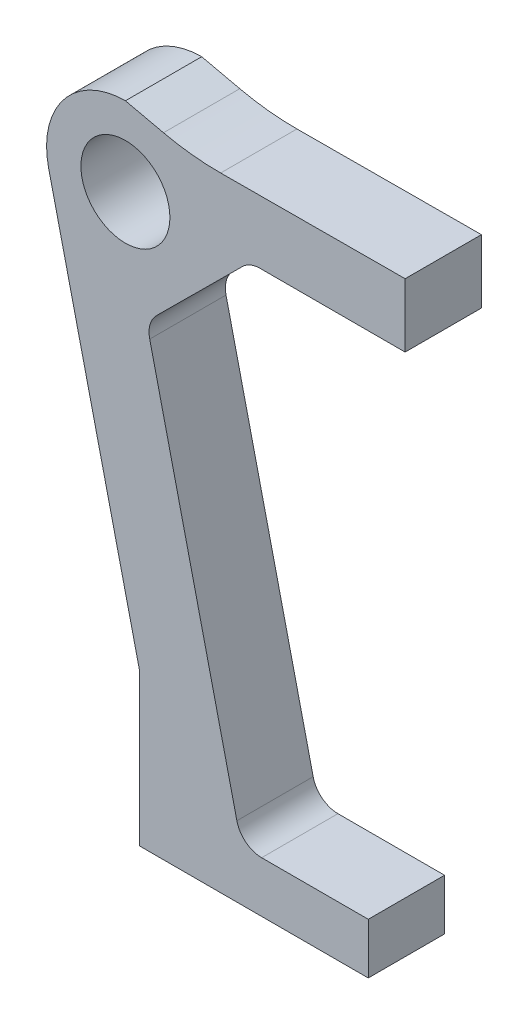
ISO-10303-21;
HEADER;
FILE_DESCRIPTION(('STEP AP214'),'2;1');
FILE_NAME('part.step','',(''),(''),'','','');
FILE_SCHEMA(('AUTOMOTIVE_DESIGN { 1 0 10303 214 1 1 1 1 }'));
ENDSEC;
DATA;
#1=APPLICATION_CONTEXT('core data for automotive mechanical design processes');
#2=APPLICATION_PROTOCOL_DEFINITION('international standard','automotive_design',2000,#1);
#3=PRODUCT_CONTEXT('',#1,'mechanical');
#4=PRODUCT('Part','Part','',(#3));
#5=PRODUCT_RELATED_PRODUCT_CATEGORY('part','',(#4));
#6=PRODUCT_DEFINITION_FORMATION('','',#4);
#7=PRODUCT_DEFINITION_CONTEXT('part definition',#1,'design');
#8=PRODUCT_DEFINITION('design','',#6,#7);
#9=PRODUCT_DEFINITION_SHAPE('','',#8);
#10=(LENGTH_UNIT() NAMED_UNIT(*) SI_UNIT(.MILLI.,.METRE.));
#11=(NAMED_UNIT(*) PLANE_ANGLE_UNIT() SI_UNIT($,.RADIAN.));
#12=(NAMED_UNIT(*) SI_UNIT($,.STERADIAN.) SOLID_ANGLE_UNIT());
#13=UNCERTAINTY_MEASURE_WITH_UNIT(LENGTH_MEASURE(1.E-05),#10,'distance_accuracy_value','');
#14=(GEOMETRIC_REPRESENTATION_CONTEXT(3) GLOBAL_UNCERTAINTY_ASSIGNED_CONTEXT((#13)) GLOBAL_UNIT_ASSIGNED_CONTEXT((#10,
#11,#12)) REPRESENTATION_CONTEXT('',''));
#15=CARTESIAN_POINT('',(0.,0.,0.));
#16=DIRECTION('',(0.,0.,1.));
#17=DIRECTION('',(1.,0.,0.));
#18=AXIS2_PLACEMENT_3D('',#15,#16,#17);
#19=CARTESIAN_POINT('',(9.357429757377,-4.925,3.2));
#20=DIRECTION('',(0.,0.,-1.));
#21=DIRECTION('',(-1.,0.,0.));
#22=AXIS2_PLACEMENT_3D('',#19,#20,#21);
#23=PLANE('',#22);
#24=DIRECTION('',(0.,-1.,0.));
#25=VECTOR('',#24,1.);
#26=CARTESIAN_POINT('',(4.55,-1.925,3.2));
#27=LINE('',#26,#25);
#28=CARTESIAN_POINT('',(4.55,-1.925,3.2));
#29=VERTEX_POINT('',#28);
#30=CARTESIAN_POINT('',(4.55000000000001,-7.925,3.2));
#31=VERTEX_POINT('',#30);
#32=EDGE_CURVE('E215',#29,#31,#27,.T.);
#33=ORIENTED_EDGE('',*,*,#32,.T.);
#34=DIRECTION('',(1.,0.,0.));
#35=VECTOR('',#34,1.);
#36=CARTESIAN_POINT('',(4.55000000000001,-7.925,3.2));
#37=LINE('',#36,#35);
#38=CARTESIAN_POINT('',(13.55,-7.925,3.2));
#39=VERTEX_POINT('',#38);
#40=EDGE_CURVE('E123',#31,#39,#37,.T.);
#41=ORIENTED_EDGE('',*,*,#40,.T.);
#42=DIRECTION('',(0.,1.,0.));
#43=VECTOR('',#42,1.);
#44=CARTESIAN_POINT('',(13.55,-7.925,3.2));
#45=LINE('',#44,#43);
#46=CARTESIAN_POINT('',(13.55,-5.925,3.2));
#47=VERTEX_POINT('',#46);
#48=EDGE_CURVE('E254',#39,#47,#45,.T.);
#49=ORIENTED_EDGE('',*,*,#48,.T.);
#50=DIRECTION('',(-1.,0.,0.));
#51=VECTOR('',#50,1.);
#52=CARTESIAN_POINT('',(13.55,-5.925,3.2));
#53=LINE('',#52,#51);
#54=CARTESIAN_POINT('',(9.357429757377,-5.925,3.2));
#55=VERTEX_POINT('',#54);
#56=EDGE_CURVE('E273',#47,#55,#53,.T.);
#57=ORIENTED_EDGE('',*,*,#56,.T.);
#58=CARTESIAN_POINT('',(9.357429757377,-4.925,3.2));
#59=DIRECTION('',(0.,0.,-1.));
#60=DIRECTION('',(-1.,0.,0.));
#61=AXIS2_PLACEMENT_3D('',#58,#59,#60);
#62=CIRCLE('',#61,1.);
#63=CARTESIAN_POINT('',(8.38358766247106,-5.15222582201239,3.2));
#64=VERTEX_POINT('',#63);
#65=EDGE_CURVE('E270',#55,#64,#62,.T.);
#66=ORIENTED_EDGE('',*,*,#65,.T.);
#67=DIRECTION('',(-0.227225822012392,0.973842094905941,0.));
#68=VECTOR('',#67,1.);
#69=CARTESIAN_POINT('',(8.38358766247106,-5.15222582201239,3.2));
#70=LINE('',#69,#68);
#71=CARTESIAN_POINT('',(4.95620251262334,9.5368262620205,3.2));
#72=VERTEX_POINT('',#71);
#73=EDGE_CURVE('E272',#64,#72,#70,.T.);
#74=ORIENTED_EDGE('',*,*,#73,.T.);
#75=CARTESIAN_POINT('',(5.93004460752928,9.76405208403289,3.2));
#76=DIRECTION('',(0.,0.,-1.));
#77=DIRECTION('',(-1.,0.,0.));
#78=AXIS2_PLACEMENT_3D('',#75,#76,#77);
#79=CIRCLE('',#78,1.);
#80=CARTESIAN_POINT('',(5.22498709725014,10.4732022142585,3.2));
#81=VERTEX_POINT('',#80);
#82=EDGE_CURVE('E275',#72,#81,#79,.T.);
#83=ORIENTED_EDGE('',*,*,#82,.T.);
#84=DIRECTION('',(0.709150130225592,0.705057510279145,0.));
#85=VECTOR('',#84,1.);
#86=CARTESIAN_POINT('',(5.22498709725014,10.4732022142585,3.2));
#87=LINE('',#86,#85);
#88=CARTESIAN_POINT('',(8.59600284324305,13.8247632838806,3.2));
#89=VERTEX_POINT('',#88);
#90=EDGE_CURVE('E281',#81,#89,#87,.T.);
#91=ORIENTED_EDGE('',*,*,#90,.T.);
#92=CARTESIAN_POINT('',(9.3010603535222,13.115613153655,3.2));
#93=DIRECTION('',(0.,0.,-1.));
#94=DIRECTION('',(1.,0.,0.));
#95=AXIS2_PLACEMENT_3D('',#92,#93,#94);
#96=CIRCLE('',#95,1.);
#97=CARTESIAN_POINT('',(9.3010603535222,14.115613153655,3.2));
#98=VERTEX_POINT('',#97);
#99=EDGE_CURVE('E283',#89,#98,#96,.T.);
#100=ORIENTED_EDGE('',*,*,#99,.T.);
#101=DIRECTION('',(1.,0.,0.));
#102=VECTOR('',#101,1.);
#103=CARTESIAN_POINT('',(15.,14.115613153655,3.2));
#104=LINE('',#103,#102);
#105=CARTESIAN_POINT('',(15.,14.115613153655,3.2));
#106=VERTEX_POINT('',#105);
#107=EDGE_CURVE('E285',#98,#106,#104,.T.);
#108=ORIENTED_EDGE('',*,*,#107,.T.);
#109=DIRECTION('',(0.,1.,0.));
#110=VECTOR('',#109,1.);
#111=CARTESIAN_POINT('',(15.,16.615613153655,3.2));
#112=LINE('',#111,#110);
#113=CARTESIAN_POINT('',(15.,16.615613153655,3.2));
#114=VERTEX_POINT('',#113);
#115=EDGE_CURVE('E287',#106,#114,#112,.T.);
#116=ORIENTED_EDGE('',*,*,#115,.T.);
#117=DIRECTION('',(-0.999992939798006,-0.00375770596806723,0.));
#118=VECTOR('',#117,1.);
#119=CARTESIAN_POINT('',(15.,16.615613153655,3.2));
#120=LINE('',#119,#118);
#121=CARTESIAN_POINT('',(7.74553051136755,16.5883527978988,3.2));
#122=VERTEX_POINT('',#121);
#123=EDGE_CURVE('E289',#114,#122,#120,.T.);
#124=ORIENTED_EDGE('',*,*,#123,.T.);
#125=CARTESIAN_POINT('',(7.70795345168687,26.5882821958789,3.2));
#126=DIRECTION('',(0.,0.,-1.));
#127=DIRECTION('',(-1.,0.,0.));
#128=AXIS2_PLACEMENT_3D('',#125,#126,#127);
#129=CIRCLE('',#128,10.);
#130=CARTESIAN_POINT('',(5.49786000033379,16.8355652956358,3.2));
#131=VERTEX_POINT('',#130);
#132=EDGE_CURVE('E166',#122,#131,#129,.T.);
#133=ORIENTED_EDGE('',*,*,#132,.T.);
#134=DIRECTION('',(-0.975271690024303,0.221009345135311,0.));
#135=VECTOR('',#134,1.);
#136=CARTESIAN_POINT('',(4.,17.175,3.2));
#137=LINE('',#136,#135);
#138=CARTESIAN_POINT('',(4.,17.175,3.2));
#139=VERTEX_POINT('',#138);
#140=EDGE_CURVE('E160',#131,#139,#137,.T.);
#141=ORIENTED_EDGE('',*,*,#140,.T.);
#142=CARTESIAN_POINT('',(4.,14.075,3.2));
#143=DIRECTION('',(0.,0.,1.));
#144=DIRECTION('',(1.,0.,0.));
#145=AXIS2_PLACEMENT_3D('',#142,#143,#144);
#146=CIRCLE('',#145,3.1);
#147=CARTESIAN_POINT('',(0.981089505791579,13.3705999517616,3.2));
#148=VERTEX_POINT('',#147);
#149=EDGE_CURVE('E164',#139,#148,#146,.T.);
#150=ORIENTED_EDGE('',*,*,#149,.T.);
#151=DIRECTION('',(0.227225822012392,-0.973842094905941,0.));
#152=VECTOR('',#151,1.);
#153=CARTESIAN_POINT('',(0.981089505791579,13.3705999517616,3.2));
#154=LINE('',#153,#152);
#155=EDGE_CURVE('E56',#148,#29,#154,.T.);
#156=ORIENTED_EDGE('',*,*,#155,.T.);
#157=EDGE_LOOP('',(#33,#41,#49,#57,#66,#74,#83,#91,#100,#108,#116,#124,#133,#141,#150,#156));
#158=FACE_BOUND('',#157,.T.);
#159=CARTESIAN_POINT('',(4.,14.075,3.2));
#160=DIRECTION('',(0.,0.,1.));
#161=DIRECTION('',(1.,0.,0.));
#162=AXIS2_PLACEMENT_3D('',#159,#160,#161);
#163=CIRCLE('',#162,1.75);
#164=CARTESIAN_POINT('',(5.75,14.075,3.2));
#165=VERTEX_POINT('',#164);
#166=EDGE_CURVE('E188',#165,#165,#163,.T.);
#167=ORIENTED_EDGE('',*,*,#166,.F.);
#168=EDGE_LOOP('',(#167));
#169=FACE_BOUND('',#168,.T.);
#170=ADVANCED_FACE('F39',(#158,#169),#23,.F.);
#171=CARTESIAN_POINT('',(9.357429757377,-4.925,0.2));
#172=DIRECTION('',(0.,0.,-1.));
#173=DIRECTION('',(-1.,0.,0.));
#174=AXIS2_PLACEMENT_3D('',#171,#172,#173);
#175=PLANE('',#174);
#176=DIRECTION('',(0.,-1.,0.));
#177=VECTOR('',#176,1.);
#178=CARTESIAN_POINT('',(4.55,-1.925,0.2));
#179=LINE('',#178,#177);
#180=CARTESIAN_POINT('',(4.55,-1.925,0.2));
#181=VERTEX_POINT('',#180);
#182=CARTESIAN_POINT('',(4.55000000000001,-7.925,0.2));
#183=VERTEX_POINT('',#182);
#184=EDGE_CURVE('E184',#181,#183,#179,.T.);
#185=ORIENTED_EDGE('',*,*,#184,.F.);
#186=DIRECTION('',(0.227225822012392,-0.973842094905941,0.));
#187=VECTOR('',#186,1.);
#188=CARTESIAN_POINT('',(0.981089505791579,13.3705999517616,0.2));
#189=LINE('',#188,#187);
#190=CARTESIAN_POINT('',(0.981089505791579,13.3705999517616,0.2));
#191=VERTEX_POINT('',#190);
#192=EDGE_CURVE('E115',#191,#181,#189,.T.);
#193=ORIENTED_EDGE('',*,*,#192,.F.);
#194=CARTESIAN_POINT('',(4.,14.075,0.2));
#195=DIRECTION('',(0.,0.,1.));
#196=DIRECTION('',(1.,0.,0.));
#197=AXIS2_PLACEMENT_3D('',#194,#195,#196);
#198=CIRCLE('',#197,3.1);
#199=CARTESIAN_POINT('',(4.,17.175,0.2));
#200=VERTEX_POINT('',#199);
#201=EDGE_CURVE('E109',#200,#191,#198,.T.);
#202=ORIENTED_EDGE('',*,*,#201,.F.);
#203=DIRECTION('',(-0.975271690024303,0.221009345135311,0.));
#204=VECTOR('',#203,1.);
#205=CARTESIAN_POINT('',(4.,17.175,0.2));
#206=LINE('',#205,#204);
#207=CARTESIAN_POINT('',(5.49786000033379,16.8355652956358,0.2));
#208=VERTEX_POINT('',#207);
#209=EDGE_CURVE('E174',#208,#200,#206,.T.);
#210=ORIENTED_EDGE('',*,*,#209,.F.);
#211=CARTESIAN_POINT('',(7.70795345168687,26.5882821958789,0.2));
#212=DIRECTION('',(0.,0.,-1.));
#213=DIRECTION('',(-1.,0.,0.));
#214=AXIS2_PLACEMENT_3D('',#211,#212,#213);
#215=CIRCLE('',#214,10.);
#216=CARTESIAN_POINT('',(7.74553051136755,16.5883527978988,0.2));
#217=VERTEX_POINT('',#216);
#218=EDGE_CURVE('E210',#217,#208,#215,.T.);
#219=ORIENTED_EDGE('',*,*,#218,.F.);
#220=DIRECTION('',(-0.999992939798006,-0.00375770596806723,0.));
#221=VECTOR('',#220,1.);
#222=CARTESIAN_POINT('',(15.,16.615613153655,0.2));
#223=LINE('',#222,#221);
#224=CARTESIAN_POINT('',(15.,16.615613153655,0.2));
#225=VERTEX_POINT('',#224);
#226=EDGE_CURVE('E208',#225,#217,#223,.T.);
#227=ORIENTED_EDGE('',*,*,#226,.F.);
#228=DIRECTION('',(0.,1.,0.));
#229=VECTOR('',#228,1.);
#230=CARTESIAN_POINT('',(15.,16.615613153655,0.2));
#231=LINE('',#230,#229);
#232=CARTESIAN_POINT('',(15.,14.115613153655,0.2));
#233=VERTEX_POINT('',#232);
#234=EDGE_CURVE('E206',#233,#225,#231,.T.);
#235=ORIENTED_EDGE('',*,*,#234,.F.);
#236=DIRECTION('',(1.,0.,0.));
#237=VECTOR('',#236,1.);
#238=CARTESIAN_POINT('',(15.,14.115613153655,0.2));
#239=LINE('',#238,#237);
#240=CARTESIAN_POINT('',(9.3010603535222,14.115613153655,0.2));
#241=VERTEX_POINT('',#240);
#242=EDGE_CURVE('E204',#241,#233,#239,.T.);
#243=ORIENTED_EDGE('',*,*,#242,.F.);
#244=CARTESIAN_POINT('',(9.3010603535222,13.115613153655,0.2));
#245=DIRECTION('',(0.,0.,-1.));
#246=DIRECTION('',(1.,0.,0.));
#247=AXIS2_PLACEMENT_3D('',#244,#245,#246);
#248=CIRCLE('',#247,1.);
#249=CARTESIAN_POINT('',(8.59600284324305,13.8247632838806,0.2));
#250=VERTEX_POINT('',#249);
#251=EDGE_CURVE('E202',#250,#241,#248,.T.);
#252=ORIENTED_EDGE('',*,*,#251,.F.);
#253=DIRECTION('',(0.709150130225592,0.705057510279145,0.));
#254=VECTOR('',#253,1.);
#255=CARTESIAN_POINT('',(5.22498709725014,10.4732022142585,0.2));
#256=LINE('',#255,#254);
#257=CARTESIAN_POINT('',(5.22498709725014,10.4732022142585,0.2));
#258=VERTEX_POINT('',#257);
#259=EDGE_CURVE('E200',#258,#250,#256,.T.);
#260=ORIENTED_EDGE('',*,*,#259,.F.);
#261=CARTESIAN_POINT('',(5.93004460752928,9.76405208403289,0.2));
#262=DIRECTION('',(0.,0.,-1.));
#263=DIRECTION('',(-1.,0.,0.));
#264=AXIS2_PLACEMENT_3D('',#261,#262,#263);
#265=CIRCLE('',#264,1.);
#266=CARTESIAN_POINT('',(4.95620251262334,9.5368262620205,0.2));
#267=VERTEX_POINT('',#266);
#268=EDGE_CURVE('E198',#267,#258,#265,.T.);
#269=ORIENTED_EDGE('',*,*,#268,.F.);
#270=DIRECTION('',(-0.227225822012392,0.973842094905941,0.));
#271=VECTOR('',#270,1.);
#272=CARTESIAN_POINT('',(8.38358766247106,-5.15222582201239,0.2));
#273=LINE('',#272,#271);
#274=CARTESIAN_POINT('',(8.38358766247106,-5.15222582201239,0.2));
#275=VERTEX_POINT('',#274);
#276=EDGE_CURVE('E196',#275,#267,#273,.T.);
#277=ORIENTED_EDGE('',*,*,#276,.F.);
#278=CARTESIAN_POINT('',(9.357429757377,-4.925,0.2));
#279=DIRECTION('',(0.,0.,-1.));
#280=DIRECTION('',(-1.,0.,0.));
#281=AXIS2_PLACEMENT_3D('',#278,#279,#280);
#282=CIRCLE('',#281,1.);
#283=CARTESIAN_POINT('',(9.357429757377,-5.925,0.2));
#284=VERTEX_POINT('',#283);
#285=EDGE_CURVE('E194',#284,#275,#282,.T.);
#286=ORIENTED_EDGE('',*,*,#285,.F.);
#287=DIRECTION('',(-1.,0.,0.));
#288=VECTOR('',#287,1.);
#289=CARTESIAN_POINT('',(13.55,-5.925,0.2));
#290=LINE('',#289,#288);
#291=CARTESIAN_POINT('',(13.55,-5.925,0.2));
#292=VERTEX_POINT('',#291);
#293=EDGE_CURVE('E192',#292,#284,#290,.T.);
#294=ORIENTED_EDGE('',*,*,#293,.F.);
#295=DIRECTION('',(0.,1.,0.));
#296=VECTOR('',#295,1.);
#297=CARTESIAN_POINT('',(13.55,-7.925,0.2));
#298=LINE('',#297,#296);
#299=CARTESIAN_POINT('',(13.55,-7.925,0.2));
#300=VERTEX_POINT('',#299);
#301=EDGE_CURVE('E190',#300,#292,#298,.T.);
#302=ORIENTED_EDGE('',*,*,#301,.F.);
#303=DIRECTION('',(1.,0.,0.));
#304=VECTOR('',#303,1.);
#305=CARTESIAN_POINT('',(4.55000000000001,-7.925,0.2));
#306=LINE('',#305,#304);
#307=EDGE_CURVE('E187',#183,#300,#306,.T.);
#308=ORIENTED_EDGE('',*,*,#307,.F.);
#309=EDGE_LOOP('',(#185,#193,#202,#210,#219,#227,#235,#243,#252,#260,#269,#277,#286,#294,#302,#308));
#310=FACE_BOUND('',#309,.T.);
#311=CARTESIAN_POINT('',(4.,14.075,0.2));
#312=DIRECTION('',(0.,0.,1.));
#313=DIRECTION('',(1.,0.,0.));
#314=AXIS2_PLACEMENT_3D('',#311,#312,#313);
#315=CIRCLE('',#314,1.75);
#316=CARTESIAN_POINT('',(5.75,14.075,0.2));
#317=VERTEX_POINT('',#316);
#318=EDGE_CURVE('E488',#317,#317,#315,.T.);
#319=ORIENTED_EDGE('',*,*,#318,.T.);
#320=EDGE_LOOP('',(#319));
#321=FACE_BOUND('',#320,.T.);
#322=ADVANCED_FACE('F258',(#310,#321),#175,.T.);
#323=CARTESIAN_POINT('',(4.55,-1.925,3.2));
#324=DIRECTION('',(1.,0.,0.));
#325=DIRECTION('',(0.,1.,0.));
#326=AXIS2_PLACEMENT_3D('',#323,#324,#325);
#327=PLANE('',#326);
#328=ORIENTED_EDGE('',*,*,#184,.T.);
#329=DIRECTION('',(0.,0.,-1.));
#330=VECTOR('',#329,1.);
#331=CARTESIAN_POINT('',(4.55000000000001,-7.925,3.2));
#332=LINE('',#331,#330);
#333=EDGE_CURVE('E11',#31,#183,#332,.T.);
#334=ORIENTED_EDGE('',*,*,#333,.F.);
#335=ORIENTED_EDGE('',*,*,#32,.F.);
#336=DIRECTION('',(0.,0.,-1.));
#337=VECTOR('',#336,1.);
#338=CARTESIAN_POINT('',(4.55,-1.925,3.2));
#339=LINE('',#338,#337);
#340=EDGE_CURVE('E180',#29,#181,#339,.T.);
#341=ORIENTED_EDGE('',*,*,#340,.T.);
#342=EDGE_LOOP('',(#328,#334,#335,#341));
#343=FACE_BOUND('',#342,.T.);
#344=ADVANCED_FACE('F41',(#343),#327,.F.);
#345=CARTESIAN_POINT('',(4.55000000000001,-7.925,3.2));
#346=DIRECTION('',(0.,1.,0.));
#347=DIRECTION('',(0.,0.,1.));
#348=AXIS2_PLACEMENT_3D('',#345,#346,#347);
#349=PLANE('',#348);
#350=ORIENTED_EDGE('',*,*,#307,.T.);
#351=DIRECTION('',(0.,0.,-1.));
#352=VECTOR('',#351,1.);
#353=CARTESIAN_POINT('',(13.55,-7.925,3.2));
#354=LINE('',#353,#352);
#355=EDGE_CURVE('E48',#39,#300,#354,.T.);
#356=ORIENTED_EDGE('',*,*,#355,.F.);
#357=ORIENTED_EDGE('',*,*,#40,.F.);
#358=ORIENTED_EDGE('',*,*,#333,.T.);
#359=EDGE_LOOP('',(#350,#356,#357,#358));
#360=FACE_BOUND('',#359,.T.);
#361=ADVANCED_FACE('F323',(#360),#349,.F.);
#362=CARTESIAN_POINT('',(13.55,-7.925,3.2));
#363=DIRECTION('',(-1.,0.,0.));
#364=DIRECTION('',(0.,0.,1.));
#365=AXIS2_PLACEMENT_3D('',#362,#363,#364);
#366=PLANE('',#365);
#367=ORIENTED_EDGE('',*,*,#301,.T.);
#368=DIRECTION('',(0.,0.,-1.));
#369=VECTOR('',#368,1.);
#370=CARTESIAN_POINT('',(13.55,-5.925,3.2));
#371=LINE('',#370,#369);
#372=EDGE_CURVE('E246',#47,#292,#371,.T.);
#373=ORIENTED_EDGE('',*,*,#372,.F.);
#374=ORIENTED_EDGE('',*,*,#48,.F.);
#375=ORIENTED_EDGE('',*,*,#355,.T.);
#376=EDGE_LOOP('',(#367,#373,#374,#375));
#377=FACE_BOUND('',#376,.T.);
#378=ADVANCED_FACE('F252',(#377),#366,.F.);
#379=CARTESIAN_POINT('',(13.55,-5.925,3.2));
#380=DIRECTION('',(0.,-1.,0.));
#381=DIRECTION('',(0.,0.,-1.));
#382=AXIS2_PLACEMENT_3D('',#379,#380,#381);
#383=PLANE('',#382);
#384=ORIENTED_EDGE('',*,*,#293,.T.);
#385=DIRECTION('',(0.,0.,-1.));
#386=VECTOR('',#385,1.);
#387=CARTESIAN_POINT('',(9.357429757377,-5.925,3.2));
#388=LINE('',#387,#386);
#389=EDGE_CURVE('E243',#55,#284,#388,.T.);
#390=ORIENTED_EDGE('',*,*,#389,.F.);
#391=ORIENTED_EDGE('',*,*,#56,.F.);
#392=ORIENTED_EDGE('',*,*,#372,.T.);
#393=EDGE_LOOP('',(#384,#390,#391,#392));
#394=FACE_BOUND('',#393,.T.);
#395=ADVANCED_FACE('F264',(#394),#383,.F.);
#396=CARTESIAN_POINT('',(9.357429757377,-4.925,3.2));
#397=DIRECTION('',(0.,0.,-1.));
#398=DIRECTION('',(-1.,0.,0.));
#399=AXIS2_PLACEMENT_3D('',#396,#397,#398);
#400=CYLINDRICAL_SURFACE('',#399,1.);
#401=ORIENTED_EDGE('',*,*,#285,.T.);
#402=DIRECTION('',(0.,0.,-1.));
#403=VECTOR('',#402,1.);
#404=CARTESIAN_POINT('',(8.38358766247106,-5.15222582201239,3.2));
#405=LINE('',#404,#403);
#406=EDGE_CURVE('E240',#64,#275,#405,.T.);
#407=ORIENTED_EDGE('',*,*,#406,.F.);
#408=ORIENTED_EDGE('',*,*,#65,.F.);
#409=ORIENTED_EDGE('',*,*,#389,.T.);
#410=EDGE_LOOP('',(#401,#407,#408,#409));
#411=FACE_BOUND('',#410,.T.);
#412=ADVANCED_FACE('F268',(#411),#400,.F.);
#413=CARTESIAN_POINT('',(8.38358766247106,-5.15222582201239,3.2));
#414=DIRECTION('',(-0.973842094905942,-0.227225822012392,0.));
#415=DIRECTION('',(0.227225822012392,-0.973842094905942,0.));
#416=AXIS2_PLACEMENT_3D('',#413,#414,#415);
#417=PLANE('',#416);
#418=ORIENTED_EDGE('',*,*,#276,.T.);
#419=DIRECTION('',(0.,0.,-1.));
#420=VECTOR('',#419,1.);
#421=CARTESIAN_POINT('',(4.95620251262334,9.5368262620205,3.2));
#422=LINE('',#421,#420);
#423=EDGE_CURVE('E237',#72,#267,#422,.T.);
#424=ORIENTED_EDGE('',*,*,#423,.F.);
#425=ORIENTED_EDGE('',*,*,#73,.F.);
#426=ORIENTED_EDGE('',*,*,#406,.T.);
#427=EDGE_LOOP('',(#418,#424,#425,#426));
#428=FACE_BOUND('',#427,.T.);
#429=ADVANCED_FACE('F336',(#428),#417,.F.);
#430=CARTESIAN_POINT('',(5.93004460752928,9.76405208403289,3.2));
#431=DIRECTION('',(0.,0.,-1.));
#432=DIRECTION('',(-1.,0.,0.));
#433=AXIS2_PLACEMENT_3D('',#430,#431,#432);
#434=CYLINDRICAL_SURFACE('',#433,1.);
#435=ORIENTED_EDGE('',*,*,#268,.T.);
#436=DIRECTION('',(0.,0.,-1.));
#437=VECTOR('',#436,1.);
#438=CARTESIAN_POINT('',(5.22498709725014,10.4732022142585,3.2));
#439=LINE('',#438,#437);
#440=EDGE_CURVE('E234',#81,#258,#439,.T.);
#441=ORIENTED_EDGE('',*,*,#440,.F.);
#442=ORIENTED_EDGE('',*,*,#82,.F.);
#443=ORIENTED_EDGE('',*,*,#423,.T.);
#444=EDGE_LOOP('',(#435,#441,#442,#443));
#445=FACE_BOUND('',#444,.T.);
#446=ADVANCED_FACE('F339',(#445),#434,.F.);
#447=CARTESIAN_POINT('',(5.22498709725014,10.4732022142585,3.2));
#448=DIRECTION('',(-0.705057510279145,0.709150130225592,0.));
#449=DIRECTION('',(-0.709150130225592,-0.705057510279145,0.));
#450=AXIS2_PLACEMENT_3D('',#447,#448,#449);
#451=PLANE('',#450);
#452=ORIENTED_EDGE('',*,*,#259,.T.);
#453=DIRECTION('',(0.,0.,-1.));
#454=VECTOR('',#453,1.);
#455=CARTESIAN_POINT('',(8.59600284324305,13.8247632838806,3.2));
#456=LINE('',#455,#454);
#457=EDGE_CURVE('E231',#89,#250,#456,.T.);
#458=ORIENTED_EDGE('',*,*,#457,.F.);
#459=ORIENTED_EDGE('',*,*,#90,.F.);
#460=ORIENTED_EDGE('',*,*,#440,.T.);
#461=EDGE_LOOP('',(#452,#458,#459,#460));
#462=FACE_BOUND('',#461,.T.);
#463=ADVANCED_FACE('F343',(#462),#451,.F.);
#464=CARTESIAN_POINT('',(9.3010603535222,13.115613153655,3.2));
#465=DIRECTION('',(0.,0.,-1.));
#466=DIRECTION('',(-1.,0.,0.));
#467=AXIS2_PLACEMENT_3D('',#464,#465,#466);
#468=CYLINDRICAL_SURFACE('',#467,1.);
#469=ORIENTED_EDGE('',*,*,#251,.T.);
#470=DIRECTION('',(0.,0.,-1.));
#471=VECTOR('',#470,1.);
#472=CARTESIAN_POINT('',(9.3010603535222,14.115613153655,3.2));
#473=LINE('',#472,#471);
#474=EDGE_CURVE('E228',#98,#241,#473,.T.);
#475=ORIENTED_EDGE('',*,*,#474,.F.);
#476=ORIENTED_EDGE('',*,*,#99,.F.);
#477=ORIENTED_EDGE('',*,*,#457,.T.);
#478=EDGE_LOOP('',(#469,#475,#476,#477));
#479=FACE_BOUND('',#478,.T.);
#480=ADVANCED_FACE('F347',(#479),#468,.F.);
#481=CARTESIAN_POINT('',(15.,14.115613153655,3.2));
#482=DIRECTION('',(0.,1.,0.));
#483=DIRECTION('',(-1.,0.,0.));
#484=AXIS2_PLACEMENT_3D('',#481,#482,#483);
#485=PLANE('',#484);
#486=ORIENTED_EDGE('',*,*,#242,.T.);
#487=DIRECTION('',(0.,0.,-1.));
#488=VECTOR('',#487,1.);
#489=CARTESIAN_POINT('',(15.,14.115613153655,3.2));
#490=LINE('',#489,#488);
#491=EDGE_CURVE('E225',#106,#233,#490,.T.);
#492=ORIENTED_EDGE('',*,*,#491,.F.);
#493=ORIENTED_EDGE('',*,*,#107,.F.);
#494=ORIENTED_EDGE('',*,*,#474,.T.);
#495=EDGE_LOOP('',(#486,#492,#493,#494));
#496=FACE_BOUND('',#495,.T.);
#497=ADVANCED_FACE('F351',(#496),#485,.F.);
#498=CARTESIAN_POINT('',(15.,16.615613153655,3.2));
#499=DIRECTION('',(-1.,0.,0.));
#500=DIRECTION('',(0.,0.,1.));
#501=AXIS2_PLACEMENT_3D('',#498,#499,#500);
#502=PLANE('',#501);
#503=ORIENTED_EDGE('',*,*,#234,.T.);
#504=DIRECTION('',(0.,0.,-1.));
#505=VECTOR('',#504,1.);
#506=CARTESIAN_POINT('',(15.,16.615613153655,3.2));
#507=LINE('',#506,#505);
#508=EDGE_CURVE('E222',#114,#225,#507,.T.);
#509=ORIENTED_EDGE('',*,*,#508,.F.);
#510=ORIENTED_EDGE('',*,*,#115,.F.);
#511=ORIENTED_EDGE('',*,*,#491,.T.);
#512=EDGE_LOOP('',(#503,#509,#510,#511));
#513=FACE_BOUND('',#512,.T.);
#514=ADVANCED_FACE('F355',(#513),#502,.F.);
#515=CARTESIAN_POINT('',(15.,16.615613153655,3.2));
#516=DIRECTION('',(0.00375770596806723,-0.999992939798006,0.));
#517=DIRECTION('',(0.999992939798006,0.00375770596806723,0.));
#518=AXIS2_PLACEMENT_3D('',#515,#516,#517);
#519=PLANE('',#518);
#520=ORIENTED_EDGE('',*,*,#226,.T.);
#521=DIRECTION('',(0.,0.,-1.));
#522=VECTOR('',#521,1.);
#523=CARTESIAN_POINT('',(7.74553051136755,16.5883527978988,3.2));
#524=LINE('',#523,#522);
#525=EDGE_CURVE('E219',#122,#217,#524,.T.);
#526=ORIENTED_EDGE('',*,*,#525,.F.);
#527=ORIENTED_EDGE('',*,*,#123,.F.);
#528=ORIENTED_EDGE('',*,*,#508,.T.);
#529=EDGE_LOOP('',(#520,#526,#527,#528));
#530=FACE_BOUND('',#529,.T.);
#531=ADVANCED_FACE('F295',(#530),#519,.F.);
#532=CARTESIAN_POINT('',(7.70795345168687,26.5882821958789,3.2));
#533=DIRECTION('',(0.,0.,-1.));
#534=DIRECTION('',(-1.,0.,0.));
#535=AXIS2_PLACEMENT_3D('',#532,#533,#534);
#536=CYLINDRICAL_SURFACE('',#535,10.);
#537=ORIENTED_EDGE('',*,*,#218,.T.);
#538=DIRECTION('',(0.,0.,-1.));
#539=VECTOR('',#538,1.);
#540=CARTESIAN_POINT('',(5.49786000033379,16.8355652956358,3.2));
#541=LINE('',#540,#539);
#542=EDGE_CURVE('E175',#131,#208,#541,.T.);
#543=ORIENTED_EDGE('',*,*,#542,.F.);
#544=ORIENTED_EDGE('',*,*,#132,.F.);
#545=ORIENTED_EDGE('',*,*,#525,.T.);
#546=EDGE_LOOP('',(#537,#543,#544,#545));
#547=FACE_BOUND('',#546,.T.);
#548=ADVANCED_FACE('F299',(#547),#536,.F.);
#549=CARTESIAN_POINT('',(4.,17.175,3.2));
#550=DIRECTION('',(-0.221009345135311,-0.975271690024303,0.));
#551=DIRECTION('',(0.975271690024303,-0.221009345135311,0.));
#552=AXIS2_PLACEMENT_3D('',#549,#550,#551);
#553=PLANE('',#552);
#554=ORIENTED_EDGE('',*,*,#209,.T.);
#555=DIRECTION('',(0.,0.,-1.));
#556=VECTOR('',#555,1.);
#557=CARTESIAN_POINT('',(4.,17.175,3.2));
#558=LINE('',#557,#556);
#559=EDGE_CURVE('E171',#139,#200,#558,.T.);
#560=ORIENTED_EDGE('',*,*,#559,.F.);
#561=ORIENTED_EDGE('',*,*,#140,.F.);
#562=ORIENTED_EDGE('',*,*,#542,.T.);
#563=EDGE_LOOP('',(#554,#560,#561,#562));
#564=FACE_BOUND('',#563,.T.);
#565=ADVANCED_FACE('F172',(#564),#553,.F.);
#566=CARTESIAN_POINT('',(4.,14.075,3.2));
#567=DIRECTION('',(0.,0.,-1.));
#568=DIRECTION('',(-1.,0.,0.));
#569=AXIS2_PLACEMENT_3D('',#566,#567,#568);
#570=CYLINDRICAL_SURFACE('',#569,3.1);
#571=ORIENTED_EDGE('',*,*,#201,.T.);
#572=DIRECTION('',(0.,0.,-1.));
#573=VECTOR('',#572,1.);
#574=CARTESIAN_POINT('',(0.981089505791579,13.3705999517616,3.2));
#575=LINE('',#574,#573);
#576=EDGE_CURVE('E176',#148,#191,#575,.T.);
#577=ORIENTED_EDGE('',*,*,#576,.F.);
#578=ORIENTED_EDGE('',*,*,#149,.F.);
#579=ORIENTED_EDGE('',*,*,#559,.T.);
#580=EDGE_LOOP('',(#571,#577,#578,#579));
#581=FACE_BOUND('',#580,.T.);
#582=ADVANCED_FACE('F178',(#581),#570,.T.);
#583=CARTESIAN_POINT('',(0.981089505791579,13.3705999517616,3.2));
#584=DIRECTION('',(0.973842094905942,0.227225822012392,0.));
#585=DIRECTION('',(-0.227225822012392,0.973842094905942,0.));
#586=AXIS2_PLACEMENT_3D('',#583,#584,#585);
#587=PLANE('',#586);
#588=ORIENTED_EDGE('',*,*,#192,.T.);
#589=ORIENTED_EDGE('',*,*,#340,.F.);
#590=ORIENTED_EDGE('',*,*,#155,.F.);
#591=ORIENTED_EDGE('',*,*,#576,.T.);
#592=EDGE_LOOP('',(#588,#589,#590,#591));
#593=FACE_BOUND('',#592,.T.);
#594=ADVANCED_FACE('F303',(#593),#587,.F.);
#595=CARTESIAN_POINT('',(4.,14.075,3.2));
#596=DIRECTION('',(0.,0.,-1.));
#597=DIRECTION('',(-1.,0.,0.));
#598=AXIS2_PLACEMENT_3D('',#595,#596,#597);
#599=CYLINDRICAL_SURFACE('',#598,1.75);
#600=ORIENTED_EDGE('',*,*,#166,.T.);
#601=EDGE_LOOP('',(#600));
#602=FACE_BOUND('',#601,.T.);
#603=ORIENTED_EDGE('',*,*,#318,.F.);
#604=EDGE_LOOP('',(#603));
#605=FACE_BOUND('',#604,.T.);
#606=ADVANCED_FACE('F305',(#602,#605),#599,.F.);
#607=CLOSED_SHELL('',(#170,#322,#344,#361,#378,#395,#412,#429,#446,#463,#480,#497,#514,#531,
#548,#565,#582,#594,#606));
#608=MANIFOLD_SOLID_BREP('B2',#607);
#609=ADVANCED_BREP_SHAPE_REPRESENTATION('',(#18,#608),#14);
#610=SHAPE_DEFINITION_REPRESENTATION(#9,#609);
ENDSEC;
END-ISO-10303-21;
